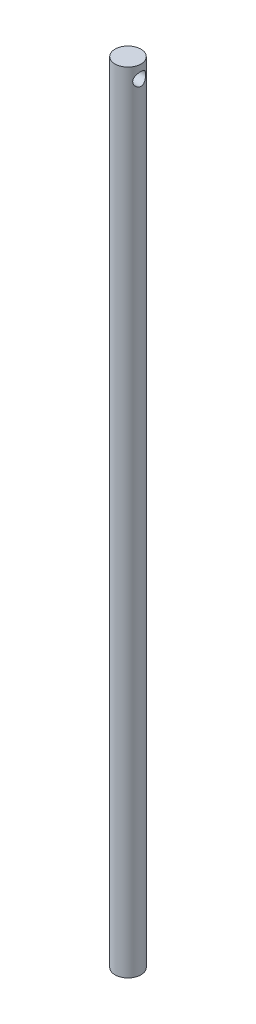
ISO-10303-21;
HEADER;
FILE_DESCRIPTION(('STEP AP214'),'2;1');
FILE_NAME('part.step','',(''),(''),'','','');
FILE_SCHEMA(('AUTOMOTIVE_DESIGN { 1 0 10303 214 1 1 1 1 }'));
ENDSEC;
DATA;
#1=APPLICATION_CONTEXT('core data for automotive mechanical design processes');
#2=APPLICATION_PROTOCOL_DEFINITION('international standard','automotive_design',2000,#1);
#3=PRODUCT_CONTEXT('',#1,'mechanical');
#4=PRODUCT('Part','Part','',(#3));
#5=PRODUCT_RELATED_PRODUCT_CATEGORY('part','',(#4));
#6=PRODUCT_DEFINITION_FORMATION('','',#4);
#7=PRODUCT_DEFINITION_CONTEXT('part definition',#1,'design');
#8=PRODUCT_DEFINITION('design','',#6,#7);
#9=PRODUCT_DEFINITION_SHAPE('','',#8);
#10=(LENGTH_UNIT() NAMED_UNIT(*) SI_UNIT(.MILLI.,.METRE.));
#11=(NAMED_UNIT(*) PLANE_ANGLE_UNIT() SI_UNIT($,.RADIAN.));
#12=(NAMED_UNIT(*) SI_UNIT($,.STERADIAN.) SOLID_ANGLE_UNIT());
#13=UNCERTAINTY_MEASURE_WITH_UNIT(LENGTH_MEASURE(1.E-05),#10,'distance_accuracy_value','');
#14=(GEOMETRIC_REPRESENTATION_CONTEXT(3) GLOBAL_UNCERTAINTY_ASSIGNED_CONTEXT((#13)) GLOBAL_UNIT_ASSIGNED_CONTEXT((#10,
#11,#12)) REPRESENTATION_CONTEXT('',''));
#15=CARTESIAN_POINT('',(0.,0.,0.));
#16=DIRECTION('',(0.,0.,1.));
#17=DIRECTION('',(1.,0.,0.));
#18=AXIS2_PLACEMENT_3D('',#15,#16,#17);
#19=CARTESIAN_POINT('',(0.,193.675,0.));
#20=DIRECTION('',(0.,-1.,0.));
#21=DIRECTION('',(0.,0.,-1.));
#22=AXIS2_PLACEMENT_3D('',#19,#20,#21);
#23=CYLINDRICAL_SURFACE('',#22,3.175);
#24=CARTESIAN_POINT('',(0.,193.675,0.));
#25=DIRECTION('',(0.,1.,0.));
#26=DIRECTION('',(0.,0.,1.));
#27=AXIS2_PLACEMENT_3D('',#24,#25,#26);
#28=CIRCLE('',#27,3.175);
#29=CARTESIAN_POINT('',(0.,193.675,3.175));
#30=VERTEX_POINT('',#29);
#31=EDGE_CURVE('E10',#30,#30,#28,.T.);
#32=ORIENTED_EDGE('',*,*,#31,.F.);
#33=EDGE_LOOP('',(#32));
#34=FACE_BOUND('',#33,.T.);
#35=CARTESIAN_POINT('',(0.,0.,0.));
#36=DIRECTION('',(0.,1.,0.));
#37=DIRECTION('',(0.,0.,1.));
#38=AXIS2_PLACEMENT_3D('',#35,#36,#37);
#39=CIRCLE('',#38,3.175);
#40=CARTESIAN_POINT('',(0.,0.,3.175));
#41=VERTEX_POINT('',#40);
#42=EDGE_CURVE('E49',#41,#41,#39,.T.);
#43=ORIENTED_EDGE('',*,*,#42,.T.);
#44=EDGE_LOOP('',(#43));
#45=FACE_BOUND('',#44,.T.);
#46=CARTESIAN_POINT('',(-2.74963065701559,190.5,1.5875));
#47=CARTESIAN_POINT('',(-2.74963786381429,190.58272114551,1.58749422638082));
#48=CARTESIAN_POINT('',(-2.75342034385563,190.665546740796,1.58099120353898));
#49=CARTESIAN_POINT('',(-2.76800256742633,190.828655782675,1.55531059571316));
#50=CARTESIAN_POINT('',(-2.77881705563201,190.908933515131,1.53610637747976));
#51=CARTESIAN_POINT('',(-2.8058958773607,191.064279517146,1.48605866856095));
#52=CARTESIAN_POINT('',(-2.82213119013787,191.139373010802,1.4552770495838));
#53=CARTESIAN_POINT('',(-2.85817730396761,191.28331092067,1.383137196535));
#54=CARTESIAN_POINT('',(-2.87798829843252,191.352154998542,1.3417783902818));
#55=CARTESIAN_POINT('',(-2.92095029628688,191.487910344085,1.24565813309277));
#56=CARTESIAN_POINT('',(-2.94424201025251,191.554193877882,1.19007260737823));
#57=CARTESIAN_POINT('',(-2.99040522672308,191.676985816596,1.06879041958796));
#58=CARTESIAN_POINT('',(-3.01327651457109,191.733489345601,1.00308874467939));
#59=CARTESIAN_POINT('',(-3.05786594662806,191.838845352447,0.858027181920595));
#60=CARTESIAN_POINT('',(-3.07940243938849,191.886925356477,0.778045162557462));
#61=CARTESIAN_POINT('',(-3.11706825308002,191.968661104528,0.609849279726711));
#62=CARTESIAN_POINT('',(-3.1332009850419,192.002325951618,0.52164065429432));
#63=CARTESIAN_POINT('',(-3.15722732225227,192.051788649815,0.346146348482488));
#64=CARTESIAN_POINT('',(-3.16562549850666,192.068687373089,0.259241592400999));
#65=CARTESIAN_POINT('',(-3.17512039355631,192.087763713397,0.0834558730578383));
#66=CARTESIAN_POINT('',(-3.17622153020536,192.089950237663,-0.00542386177692817));
#67=CARTESIAN_POINT('',(-3.17123733792365,192.079964655072,-0.174359132522697));
#68=CARTESIAN_POINT('',(-3.16576862228805,192.06902465036,-0.254509903693152));
#69=CARTESIAN_POINT('',(-3.14919114349849,192.035301660301,-0.411660612920332));
#70=CARTESIAN_POINT('',(-3.138081958304,192.01251778875,-0.4886603147366));
#71=CARTESIAN_POINT('',(-3.11104888469151,191.955606426332,-0.638666159116664));
#72=CARTESIAN_POINT('',(-3.09506050927603,191.921326352839,-0.71160230983035));
#73=CARTESIAN_POINT('',(-3.05971013003866,191.84260682678,-0.850863172402412));
#74=CARTESIAN_POINT('',(-3.04034691900006,191.798163737007,-0.917185505031346));
#75=CARTESIAN_POINT('',(-2.99790476108776,191.695553629441,-1.04802568667588));
#76=CARTESIAN_POINT('',(-2.97464759397103,191.636486442532,-1.11178034410911));
#77=CARTESIAN_POINT('',(-2.92821265681564,191.508713811673,-1.22889068784772));
#78=CARTESIAN_POINT('',(-2.90503496121686,191.440001021515,-1.28223837337408));
#79=CARTESIAN_POINT('',(-2.8597884779682,191.289545994527,-1.3803397187445));
#80=CARTESIAN_POINT('',(-2.83788357985249,191.207253438401,-1.42433248752764));
#81=CARTESIAN_POINT('',(-2.7999602731724,191.035086446718,-1.49751909188944));
#82=CARTESIAN_POINT('',(-2.78393572698132,190.945220037585,-1.52672836990978));
#83=CARTESIAN_POINT('',(-2.76137109359542,190.767946963339,-1.56714858500225));
#84=CARTESIAN_POINT('',(-2.75418003659488,190.680909723518,-1.57960238136546));
#85=CARTESIAN_POINT('',(-2.74824696986555,190.505712870342,-1.58990815274564));
#86=CARTESIAN_POINT('',(-2.74949899186782,190.417554093772,-1.5877704422376));
#87=CARTESIAN_POINT('',(-2.75962009258178,190.252899404256,-1.57009471880855));
#88=CARTESIAN_POINT('',(-2.76764095166813,190.176182621366,-1.55604815903104));
#89=CARTESIAN_POINT('',(-2.78914259212754,190.026341139295,-1.517167851854));
#90=CARTESIAN_POINT('',(-2.80262514157991,189.95321761194,-1.49233061106498));
#91=CARTESIAN_POINT('',(-2.83426252551455,189.808784512192,-1.43136554691025));
#92=CARTESIAN_POINT('',(-2.85260483648363,189.737715810745,-1.39476807611219));
#93=CARTESIAN_POINT('',(-2.89172839701884,189.602317531432,-1.31173071412508));
#94=CARTESIAN_POINT('',(-2.91251089701297,189.537991440923,-1.26528576687739));
#95=CARTESIAN_POINT('',(-2.95732197549433,189.409421206556,-1.15702900292818));
#96=CARTESIAN_POINT('',(-2.98142950757433,189.346209523236,-1.09401811980002));
#97=CARTESIAN_POINT('',(-3.02790598027404,189.230933072185,-0.957904636444801));
#98=CARTESIAN_POINT('',(-3.05027433199738,189.178872069759,-0.884798641015382));
#99=CARTESIAN_POINT('',(-3.09151911684394,189.086214210054,-0.727924888062043));
#100=CARTESIAN_POINT('',(-3.11028781154346,189.04595617484,-0.643926667398916));
#101=CARTESIAN_POINT('',(-3.1413982599789,188.980543577626,-0.469141753867724));
#102=CARTESIAN_POINT('',(-3.15374565586242,188.955375753456,-0.378361100960084));
#103=CARTESIAN_POINT('',(-3.16972169238739,188.923027404373,-0.20158024569954));
#104=CARTESIAN_POINT('',(-3.17404635554253,188.914408372047,-0.115905667112604));
#105=CARTESIAN_POINT('',(-3.17566881970521,188.911161316091,0.0557625026975335));
#106=CARTESIAN_POINT('',(-3.17296908056188,188.916528394719,0.141755971718449));
#107=CARTESIAN_POINT('',(-3.16125175530202,188.940148545788,0.30565406280347));
#108=CARTESIAN_POINT('',(-3.15266220285434,188.957529198197,0.38371830452538));
#109=CARTESIAN_POINT('',(-3.13042448690684,189.003506611393,0.535695449091491));
#110=CARTESIAN_POINT('',(-3.11677559798313,189.032104980648,0.609607754866868));
#111=CARTESIAN_POINT('',(-3.08492415062641,189.100979195313,0.754734657413756));
#112=CARTESIAN_POINT('',(-3.06655179803093,189.141702175592,0.825698664036328));
#113=CARTESIAN_POINT('',(-3.02717411362649,189.233108215239,0.960079743879767));
#114=CARTESIAN_POINT('',(-3.00616757411397,189.283795849221,1.02349332927116));
#115=CARTESIAN_POINT('',(-2.96114168734771,189.399540458199,1.14762598159906));
#116=CARTESIAN_POINT('',(-2.9370305593107,189.46552544887,1.20744882420609));
#117=CARTESIAN_POINT('',(-2.89025133408528,189.606953019794,1.31550296873905));
#118=CARTESIAN_POINT('',(-2.86758452646961,189.682403878127,1.36372401564097));
#119=CARTESIAN_POINT('',(-2.82574373421554,189.843785676447,1.44848433915973));
#120=CARTESIAN_POINT('',(-2.80670276631829,189.929972455667,1.48460629221299));
#121=CARTESIAN_POINT('',(-2.77600023171258,190.108415191889,1.54126995134142));
#122=CARTESIAN_POINT('',(-2.76431400634477,190.200649711149,1.56186376599086));
#123=CARTESIAN_POINT('',(-2.75477720255342,190.328241002097,1.57855762498476));
#124=CARTESIAN_POINT('',(-2.75285404795678,190.362471532357,1.58190581663011));
#125=CARTESIAN_POINT('',(-2.75027923221803,190.431128663083,1.58637828058032));
#126=CARTESIAN_POINT('',(-2.74962765613611,190.465555276513,1.58750240410979));
#127=CARTESIAN_POINT('',(-2.74963065701559,190.5,1.5875));
#128=B_SPLINE_CURVE_WITH_KNOTS('',3,(#46,#47,#48,#49,#50,#51,#52,#53,#54,#55,#56,#57,#58,#59,
#60,#61,#62,#63,#64,#65,#66,#67,#68,#69,#70,#71,#72,#73,#74,#75,#76,#77,#78,#79,#80,#81,#82,#83,
#84,#85,#86,#87,#88,#89,#90,#91,#92,#93,#94,#95,#96,#97,#98,#99,#100,#101,#102,#103,#104,#105,
#106,#107,#108,#109,#110,#111,#112,#113,#114,#115,#116,#117,#118,#119,#120,#121,#122,#123,#124,
#125,#126,#127),.UNSPECIFIED.,.T.,.F.,(4,2,2,2,2,2,2,2,2,2,2,2,2,2,2,2,2,2,2,2,2,2,2,2,2,2,2,2,
2,2,2,2,2,2,2,2,2,2,2,2,4),(0.,0.248018494619107,0.496558717359377,0.743789146021194,
0.991032951644176,1.25866892109095,1.5264379409644,1.81225653929036,2.09789437805177,
2.36320782386597,2.62836062601587,2.87045554756704,3.1125685862146,3.35803136385696,
3.60358212718556,3.87234416437813,4.14131201590394,4.42736036245496,4.71310929061081,
4.9762138673106,5.23913247936542,5.47329016185641,5.70752370742249,5.95260583044665,
6.19781409374324,6.47393205434221,6.75014310652894,7.03364387993081,7.31689512946424,
7.5741572924331,7.83132937785429,8.07155524483494,8.3118155695032,8.56235191767162,
8.8130035528489,9.08860008936982,9.36443934266681,9.64899564098785,9.93259273641878,
10.0358596460668,10.1391334633508),.UNSPECIFIED.);
#129=CARTESIAN_POINT('',(-2.74963065701559,190.5,1.5875));
#130=VERTEX_POINT('',#129);
#131=EDGE_CURVE('E56',#130,#130,#128,.T.);
#132=ORIENTED_EDGE('',*,*,#131,.F.);
#133=EDGE_LOOP('',(#132));
#134=FACE_BOUND('',#133,.T.);
#135=CARTESIAN_POINT('',(2.74963065701559,190.5,1.5875));
#136=CARTESIAN_POINT('',(2.74963786381429,190.41727885449,1.58749422638082));
#137=CARTESIAN_POINT('',(2.75342034385563,190.334453259204,1.58099120353898));
#138=CARTESIAN_POINT('',(2.76800256742633,190.171344217325,1.55531059571316));
#139=CARTESIAN_POINT('',(2.77881705563201,190.091066484869,1.53610637747976));
#140=CARTESIAN_POINT('',(2.8058958773607,189.935720482854,1.48605866856095));
#141=CARTESIAN_POINT('',(2.82213119013788,189.860626989198,1.4552770495838));
#142=CARTESIAN_POINT('',(2.85817730396762,189.71668907933,1.38313719653499));
#143=CARTESIAN_POINT('',(2.87798829843252,189.647845001458,1.3417783902818));
#144=CARTESIAN_POINT('',(2.92095029628688,189.512089655915,1.24565813309277));
#145=CARTESIAN_POINT('',(2.94424201025251,189.445806122118,1.19007260737823));
#146=CARTESIAN_POINT('',(2.99040522672308,189.323014183404,1.06879041958796));
#147=CARTESIAN_POINT('',(3.01327651457109,189.266510654399,1.00308874467939));
#148=CARTESIAN_POINT('',(3.05786594662807,189.161154647553,0.858027181920591));
#149=CARTESIAN_POINT('',(3.07940243938849,189.113074643523,0.778045162557459));
#150=CARTESIAN_POINT('',(3.11706825308002,189.031338895472,0.609849279726706));
#151=CARTESIAN_POINT('',(3.1332009850419,188.997674048382,0.521640654294316));
#152=CARTESIAN_POINT('',(3.15722732225227,188.948211350184,0.346146348482487));
#153=CARTESIAN_POINT('',(3.16562549850666,188.931312626911,0.259241592400998));
#154=CARTESIAN_POINT('',(3.17512039355631,188.912236286603,0.0834558730578388));
#155=CARTESIAN_POINT('',(3.17622153020536,188.910049762337,-0.00542386177692805));
#156=CARTESIAN_POINT('',(3.17123733792365,188.920035344928,-0.174359132522697));
#157=CARTESIAN_POINT('',(3.16576862228805,188.93097534964,-0.254509903693152));
#158=CARTESIAN_POINT('',(3.14919114349849,188.964698339699,-0.411660612920332));
#159=CARTESIAN_POINT('',(3.138081958304,188.98748221125,-0.4886603147366));
#160=CARTESIAN_POINT('',(3.11104888469151,189.044393573668,-0.638666159116664));
#161=CARTESIAN_POINT('',(3.09506050927603,189.078673647161,-0.71160230983035));
#162=CARTESIAN_POINT('',(3.05971013003866,189.15739317322,-0.850863172402412));
#163=CARTESIAN_POINT('',(3.04034691900006,189.201836262992,-0.917185505031346));
#164=CARTESIAN_POINT('',(2.99790476108776,189.304446370559,-1.04802568667588));
#165=CARTESIAN_POINT('',(2.97464759397103,189.363513557468,-1.11178034410911));
#166=CARTESIAN_POINT('',(2.92821265681564,189.491286188327,-1.22889068784772));
#167=CARTESIAN_POINT('',(2.90503496121686,189.559998978485,-1.28223837337408));
#168=CARTESIAN_POINT('',(2.8597884779682,189.710454005473,-1.3803397187445));
#169=CARTESIAN_POINT('',(2.83788357985248,189.792746561599,-1.42433248752765));
#170=CARTESIAN_POINT('',(2.79996027317239,189.964913553282,-1.49751909188945));
#171=CARTESIAN_POINT('',(2.78393572698132,190.054779962415,-1.52672836990978));
#172=CARTESIAN_POINT('',(2.76137109359542,190.232053036661,-1.56714858500225));
#173=CARTESIAN_POINT('',(2.75418003659488,190.319090276482,-1.57960238136546));
#174=CARTESIAN_POINT('',(2.74824696986555,190.494287129657,-1.58990815274564));
#175=CARTESIAN_POINT('',(2.74949899186782,190.582445906228,-1.5877704422376));
#176=CARTESIAN_POINT('',(2.75962009258178,190.747100595744,-1.57009471880855));
#177=CARTESIAN_POINT('',(2.76764095166813,190.823817378634,-1.55604815903104));
#178=CARTESIAN_POINT('',(2.78914259212754,190.973658860705,-1.517167851854));
#179=CARTESIAN_POINT('',(2.80262514157991,191.04678238806,-1.49233061106498));
#180=CARTESIAN_POINT('',(2.83426252551455,191.191215487808,-1.43136554691025));
#181=CARTESIAN_POINT('',(2.85260483648363,191.262284189255,-1.39476807611219));
#182=CARTESIAN_POINT('',(2.89172839701884,191.397682468568,-1.31173071412508));
#183=CARTESIAN_POINT('',(2.91251089701297,191.462008559077,-1.26528576687739));
#184=CARTESIAN_POINT('',(2.95732197549433,191.590578793444,-1.15702900292818));
#185=CARTESIAN_POINT('',(2.98142950757433,191.653790476764,-1.09401811980002));
#186=CARTESIAN_POINT('',(3.02790598027404,191.769066927815,-0.957904636444801));
#187=CARTESIAN_POINT('',(3.05027433199738,191.821127930241,-0.884798641015382));
#188=CARTESIAN_POINT('',(3.09151911684394,191.913785789946,-0.727924888062043));
#189=CARTESIAN_POINT('',(3.11028781154346,191.95404382516,-0.643926667398916));
#190=CARTESIAN_POINT('',(3.1413982599789,192.019456422374,-0.469141753867724));
#191=CARTESIAN_POINT('',(3.15374565586242,192.044624246544,-0.378361100960084));
#192=CARTESIAN_POINT('',(3.16972169238739,192.076972595627,-0.20158024569954));
#193=CARTESIAN_POINT('',(3.17404635554253,192.085591627953,-0.115905667112604));
#194=CARTESIAN_POINT('',(3.17566881970521,192.088838683909,0.0557625026975335));
#195=CARTESIAN_POINT('',(3.17296908056188,192.083471605281,0.141755971718449));
#196=CARTESIAN_POINT('',(3.16125175530202,192.059851454212,0.30565406280347));
#197=CARTESIAN_POINT('',(3.15266220285434,192.042470801803,0.38371830452538));
#198=CARTESIAN_POINT('',(3.13042448690684,191.996493388606,0.535695449091491));
#199=CARTESIAN_POINT('',(3.11677559798313,191.967895019352,0.609607754866868));
#200=CARTESIAN_POINT('',(3.08492415062641,191.899020804687,0.754734657413756));
#201=CARTESIAN_POINT('',(3.06655179803093,191.858297824408,0.825698664036328));
#202=CARTESIAN_POINT('',(3.02717411362649,191.766891784761,0.960079743879767));
#203=CARTESIAN_POINT('',(3.00616757411397,191.716204150779,1.02349332927116));
#204=CARTESIAN_POINT('',(2.96114168734771,191.600459541801,1.14762598159906));
#205=CARTESIAN_POINT('',(2.9370305593107,191.53447455113,1.20744882420609));
#206=CARTESIAN_POINT('',(2.89025133408528,191.393046980206,1.31550296873905));
#207=CARTESIAN_POINT('',(2.86758452646961,191.317596121873,1.36372401564097));
#208=CARTESIAN_POINT('',(2.82574373421554,191.156214323553,1.44848433915973));
#209=CARTESIAN_POINT('',(2.80670276631829,191.070027544333,1.48460629221299));
#210=CARTESIAN_POINT('',(2.77600023171258,190.891584808111,1.54126995134142));
#211=CARTESIAN_POINT('',(2.76431400634477,190.799350288851,1.56186376599086));
#212=CARTESIAN_POINT('',(2.75477720255342,190.671758997902,1.57855762498476));
#213=CARTESIAN_POINT('',(2.75285404795678,190.637528467643,1.58190581663011));
#214=CARTESIAN_POINT('',(2.75027923221803,190.568871336917,1.58637828058032));
#215=CARTESIAN_POINT('',(2.74962765613611,190.534444723487,1.58750240410979));
#216=CARTESIAN_POINT('',(2.74963065701559,190.5,1.5875));
#217=B_SPLINE_CURVE_WITH_KNOTS('',3,(#135,#136,#137,#138,#139,#140,#141,#142,#143,#144,#145,
#146,#147,#148,#149,#150,#151,#152,#153,#154,#155,#156,#157,#158,#159,#160,#161,#162,#163,#164,
#165,#166,#167,#168,#169,#170,#171,#172,#173,#174,#175,#176,#177,#178,#179,#180,#181,#182,#183,
#184,#185,#186,#187,#188,#189,#190,#191,#192,#193,#194,#195,#196,#197,#198,#199,#200,#201,#202,
#203,#204,#205,#206,#207,#208,#209,#210,#211,#212,#213,#214,#215,#216),.UNSPECIFIED.,.T.,.F.,(4,
2,2,2,2,2,2,2,2,2,2,2,2,2,2,2,2,2,2,2,2,2,2,2,2,2,2,2,2,2,2,2,2,2,2,2,2,2,2,2,4),(0.,
0.248018494619107,0.496558717359377,0.743789146021224,0.991032951644177,1.25866892109095,
1.5264379409644,1.81225653929038,2.09789437805178,2.36320782386597,2.62836062601588,
2.87045554756704,3.1125685862146,3.35803136385697,3.60358212718556,3.87234416437814,
4.14131201590394,4.42736036245497,4.71310929061081,4.9762138673106,5.23913247936542,
5.47329016185642,5.7075237074225,5.95260583044666,6.19781409374325,6.47393205434222,
6.75014310652894,7.03364387993082,7.31689512946424,7.5741572924331,7.8313293778543,
8.07155524483495,8.3118155695032,8.56235191767163,8.8130035528489,9.08860008936982,
9.36443934266681,9.64899564098785,9.93259273641879,10.0358596460668,10.1391334633508),.UNSPECIFIED.);
#218=CARTESIAN_POINT('',(2.74963065701559,190.5,1.5875));
#219=VERTEX_POINT('',#218);
#220=EDGE_CURVE('E40',#219,#219,#217,.T.);
#221=ORIENTED_EDGE('',*,*,#220,.F.);
#222=EDGE_LOOP('',(#221));
#223=FACE_BOUND('',#222,.T.);
#224=ADVANCED_FACE('F36',(#34,#45,#134,#223),#23,.T.);
#225=CARTESIAN_POINT('',(0.,193.675,0.));
#226=DIRECTION('',(0.,1.,0.));
#227=DIRECTION('',(0.,0.,1.));
#228=AXIS2_PLACEMENT_3D('',#225,#226,#227);
#229=PLANE('',#228);
#230=ORIENTED_EDGE('',*,*,#31,.T.);
#231=EDGE_LOOP('',(#230));
#232=FACE_BOUND('',#231,.T.);
#233=ADVANCED_FACE('F68',(#232),#229,.T.);
#234=CARTESIAN_POINT('',(0.,0.,0.));
#235=DIRECTION('',(0.,1.,0.));
#236=DIRECTION('',(0.,0.,1.));
#237=AXIS2_PLACEMENT_3D('',#234,#235,#236);
#238=PLANE('',#237);
#239=ORIENTED_EDGE('',*,*,#42,.F.);
#240=EDGE_LOOP('',(#239));
#241=FACE_BOUND('',#240,.T.);
#242=ADVANCED_FACE('F66',(#241),#238,.F.);
#243=CARTESIAN_POINT('',(9.398,190.5,0.));
#244=DIRECTION('',(-1.,0.,0.));
#245=DIRECTION('',(0.,0.,1.));
#246=AXIS2_PLACEMENT_3D('',#243,#244,#245);
#247=CYLINDRICAL_SURFACE('',#246,1.5875);
#248=ORIENTED_EDGE('',*,*,#131,.T.);
#249=EDGE_LOOP('',(#248));
#250=FACE_BOUND('',#249,.T.);
#251=ORIENTED_EDGE('',*,*,#220,.T.);
#252=EDGE_LOOP('',(#251));
#253=FACE_BOUND('',#252,.T.);
#254=ADVANCED_FACE('F62',(#250,#253),#247,.F.);
#255=CLOSED_SHELL('',(#224,#233,#242,#254));
#256=MANIFOLD_SOLID_BREP('B2',#255);
#257=ADVANCED_BREP_SHAPE_REPRESENTATION('',(#18,#256),#14);
#258=SHAPE_DEFINITION_REPRESENTATION(#9,#257);
ENDSEC;
END-ISO-10303-21;
